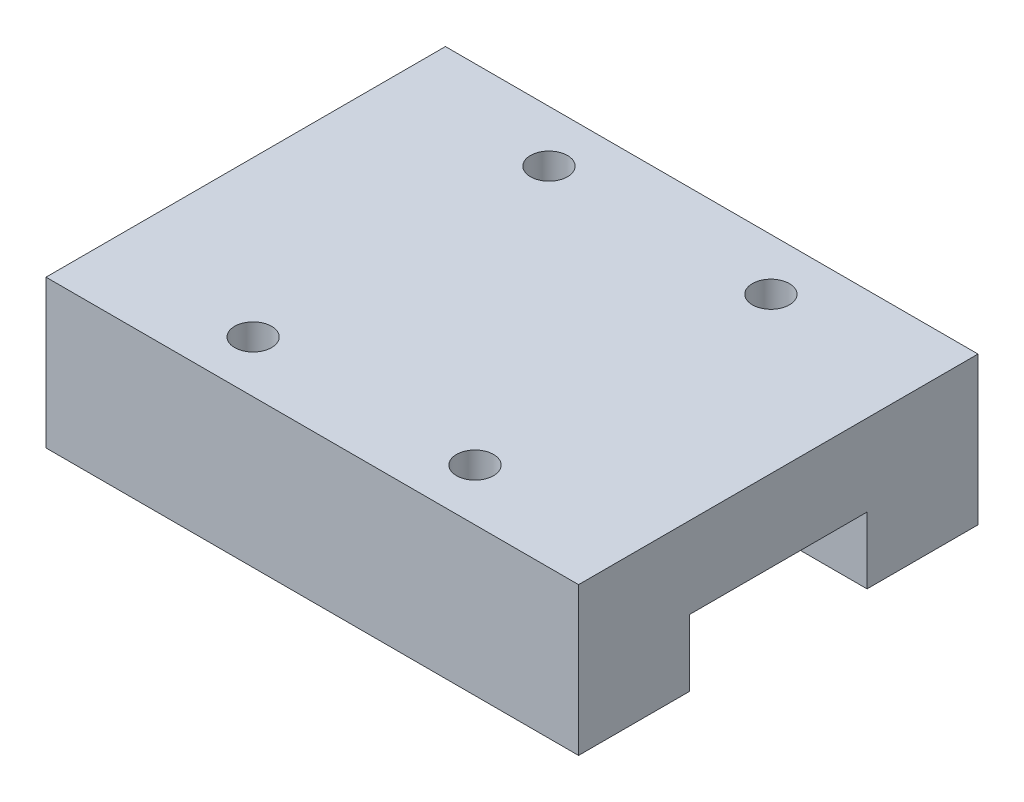
ISO-10303-21;
HEADER;
FILE_DESCRIPTION(('STEP AP214'),'2;1');
FILE_NAME('part.step','',(''),(''),'','','');
FILE_SCHEMA(('AUTOMOTIVE_DESIGN { 1 0 10303 214 1 1 1 1 }'));
ENDSEC;
DATA;
#1=APPLICATION_CONTEXT('core data for automotive mechanical design processes');
#2=APPLICATION_PROTOCOL_DEFINITION('international standard','automotive_design',2000,#1);
#3=PRODUCT_CONTEXT('',#1,'mechanical');
#4=PRODUCT('Part','Part','',(#3));
#5=PRODUCT_RELATED_PRODUCT_CATEGORY('part','',(#4));
#6=PRODUCT_DEFINITION_FORMATION('','',#4);
#7=PRODUCT_DEFINITION_CONTEXT('part definition',#1,'design');
#8=PRODUCT_DEFINITION('design','',#6,#7);
#9=PRODUCT_DEFINITION_SHAPE('','',#8);
#10=(LENGTH_UNIT() NAMED_UNIT(*) SI_UNIT(.MILLI.,.METRE.));
#11=(NAMED_UNIT(*) PLANE_ANGLE_UNIT() SI_UNIT($,.RADIAN.));
#12=(NAMED_UNIT(*) SI_UNIT($,.STERADIAN.) SOLID_ANGLE_UNIT());
#13=UNCERTAINTY_MEASURE_WITH_UNIT(LENGTH_MEASURE(1.E-05),#10,'distance_accuracy_value','');
#14=(GEOMETRIC_REPRESENTATION_CONTEXT(3) GLOBAL_UNCERTAINTY_ASSIGNED_CONTEXT((#13)) GLOBAL_UNIT_ASSIGNED_CONTEXT((#10,
#11,#12)) REPRESENTATION_CONTEXT('',''));
#15=CARTESIAN_POINT('',(0.,0.,0.));
#16=DIRECTION('',(0.,0.,1.));
#17=DIRECTION('',(1.,0.,0.));
#18=AXIS2_PLACEMENT_3D('',#15,#16,#17);
#19=CARTESIAN_POINT('',(36.,0.,13.5));
#20=DIRECTION('',(0.,0.,-1.));
#21=DIRECTION('',(0.,1.,0.));
#22=AXIS2_PLACEMENT_3D('',#19,#20,#21);
#23=PLANE('',#22);
#24=DIRECTION('',(0.,-1.,0.));
#25=VECTOR('',#24,1.);
#26=CARTESIAN_POINT('',(0.,0.,13.5));
#27=LINE('',#26,#25);
#28=CARTESIAN_POINT('',(0.,0.,13.5));
#29=VERTEX_POINT('',#28);
#30=CARTESIAN_POINT('',(0.,-10.,13.5));
#31=VERTEX_POINT('',#30);
#32=EDGE_CURVE('E133',#29,#31,#27,.T.);
#33=ORIENTED_EDGE('',*,*,#32,.T.);
#34=DIRECTION('',(-1.,0.,0.));
#35=VECTOR('',#34,1.);
#36=CARTESIAN_POINT('',(36.,-10.,13.5));
#37=LINE('',#36,#35);
#38=CARTESIAN_POINT('',(36.,-10.,13.5));
#39=VERTEX_POINT('',#38);
#40=EDGE_CURVE('E11',#39,#31,#37,.T.);
#41=ORIENTED_EDGE('',*,*,#40,.F.);
#42=DIRECTION('',(0.,-1.,0.));
#43=VECTOR('',#42,1.);
#44=CARTESIAN_POINT('',(36.,0.,13.5));
#45=LINE('',#44,#43);
#46=CARTESIAN_POINT('',(36.,0.,13.5));
#47=VERTEX_POINT('',#46);
#48=EDGE_CURVE('E148',#47,#39,#45,.T.);
#49=ORIENTED_EDGE('',*,*,#48,.F.);
#50=DIRECTION('',(-1.,0.,0.));
#51=VECTOR('',#50,1.);
#52=CARTESIAN_POINT('',(36.,0.,13.5));
#53=LINE('',#52,#51);
#54=EDGE_CURVE('E129',#47,#29,#53,.T.);
#55=ORIENTED_EDGE('',*,*,#54,.T.);
#56=EDGE_LOOP('',(#33,#41,#49,#55));
#57=FACE_BOUND('',#56,.T.);
#58=ADVANCED_FACE('F34',(#57),#23,.F.);
#59=CARTESIAN_POINT('',(36.,-10.,13.5));
#60=DIRECTION('',(0.,1.,0.));
#61=DIRECTION('',(0.,0.,1.));
#62=AXIS2_PLACEMENT_3D('',#59,#60,#61);
#63=PLANE('',#62);
#64=DIRECTION('',(0.,0.,-1.));
#65=VECTOR('',#64,1.);
#66=CARTESIAN_POINT('',(0.,-10.,13.5));
#67=LINE('',#66,#65);
#68=CARTESIAN_POINT('',(0.,-10.,6.));
#69=VERTEX_POINT('',#68);
#70=EDGE_CURVE('E136',#31,#69,#67,.T.);
#71=ORIENTED_EDGE('',*,*,#70,.T.);
#72=DIRECTION('',(-1.,0.,0.));
#73=VECTOR('',#72,1.);
#74=CARTESIAN_POINT('',(36.,-10.,6.));
#75=LINE('',#74,#73);
#76=CARTESIAN_POINT('',(36.,-10.,6.));
#77=VERTEX_POINT('',#76);
#78=EDGE_CURVE('E42',#77,#69,#75,.T.);
#79=ORIENTED_EDGE('',*,*,#78,.F.);
#80=DIRECTION('',(0.,0.,-1.));
#81=VECTOR('',#80,1.);
#82=CARTESIAN_POINT('',(36.,-10.,13.5));
#83=LINE('',#82,#81);
#84=EDGE_CURVE('E94',#39,#77,#83,.T.);
#85=ORIENTED_EDGE('',*,*,#84,.F.);
#86=ORIENTED_EDGE('',*,*,#40,.T.);
#87=EDGE_LOOP('',(#71,#79,#85,#86));
#88=FACE_BOUND('',#87,.T.);
#89=ADVANCED_FACE('F234',(#88),#63,.F.);
#90=CARTESIAN_POINT('',(36.,-5.5,6.));
#91=DIRECTION('',(0.,0.,1.));
#92=DIRECTION('',(0.,-1.,0.));
#93=AXIS2_PLACEMENT_3D('',#90,#91,#92);
#94=PLANE('',#93);
#95=DIRECTION('',(0.,1.,0.));
#96=VECTOR('',#95,1.);
#97=CARTESIAN_POINT('',(0.,-5.5,6.));
#98=LINE('',#97,#96);
#99=CARTESIAN_POINT('',(0.,-5.5,6.));
#100=VERTEX_POINT('',#99);
#101=EDGE_CURVE('E139',#69,#100,#98,.T.);
#102=ORIENTED_EDGE('',*,*,#101,.T.);
#103=DIRECTION('',(-1.,0.,0.));
#104=VECTOR('',#103,1.);
#105=CARTESIAN_POINT('',(36.,-5.5,6.));
#106=LINE('',#105,#104);
#107=CARTESIAN_POINT('',(36.,-5.5,6.));
#108=VERTEX_POINT('',#107);
#109=EDGE_CURVE('E155',#108,#100,#106,.T.);
#110=ORIENTED_EDGE('',*,*,#109,.F.);
#111=DIRECTION('',(0.,1.,0.));
#112=VECTOR('',#111,1.);
#113=CARTESIAN_POINT('',(36.,-5.5,6.));
#114=LINE('',#113,#112);
#115=EDGE_CURVE('E163',#77,#108,#114,.T.);
#116=ORIENTED_EDGE('',*,*,#115,.F.);
#117=ORIENTED_EDGE('',*,*,#78,.T.);
#118=EDGE_LOOP('',(#102,#110,#116,#117));
#119=FACE_BOUND('',#118,.T.);
#120=ADVANCED_FACE('F161',(#119),#94,.F.);
#121=CARTESIAN_POINT('',(36.,-5.5,6.));
#122=DIRECTION('',(0.,1.,0.));
#123=DIRECTION('',(0.,0.,1.));
#124=AXIS2_PLACEMENT_3D('',#121,#122,#123);
#125=PLANE('',#124);
#126=DIRECTION('',(0.,0.,-1.));
#127=VECTOR('',#126,1.);
#128=CARTESIAN_POINT('',(0.,-5.5,6.));
#129=LINE('',#128,#127);
#130=CARTESIAN_POINT('',(0.,-5.5,-6.));
#131=VERTEX_POINT('',#130);
#132=EDGE_CURVE('E141',#100,#131,#129,.T.);
#133=ORIENTED_EDGE('',*,*,#132,.T.);
#134=DIRECTION('',(-1.,0.,0.));
#135=VECTOR('',#134,1.);
#136=CARTESIAN_POINT('',(36.,-5.5,-6.));
#137=LINE('',#136,#135);
#138=CARTESIAN_POINT('',(36.,-5.5,-6.));
#139=VERTEX_POINT('',#138);
#140=EDGE_CURVE('E152',#139,#131,#137,.T.);
#141=ORIENTED_EDGE('',*,*,#140,.F.);
#142=DIRECTION('',(0.,0.,-1.));
#143=VECTOR('',#142,1.);
#144=CARTESIAN_POINT('',(36.,-5.5,6.));
#145=LINE('',#144,#143);
#146=EDGE_CURVE('E175',#108,#139,#145,.T.);
#147=ORIENTED_EDGE('',*,*,#146,.F.);
#148=ORIENTED_EDGE('',*,*,#109,.T.);
#149=EDGE_LOOP('',(#133,#141,#147,#148));
#150=FACE_BOUND('',#149,.T.);
#151=ADVANCED_FACE('F171',(#150),#125,.F.);
#152=CARTESIAN_POINT('',(36.,-5.5,-6.));
#153=DIRECTION('',(0.,0.,-1.));
#154=DIRECTION('',(0.,1.,0.));
#155=AXIS2_PLACEMENT_3D('',#152,#153,#154);
#156=PLANE('',#155);
#157=DIRECTION('',(0.,-1.,0.));
#158=VECTOR('',#157,1.);
#159=CARTESIAN_POINT('',(0.,-5.5,-6.));
#160=LINE('',#159,#158);
#161=CARTESIAN_POINT('',(0.,-10.,-6.));
#162=VERTEX_POINT('',#161);
#163=EDGE_CURVE('E143',#131,#162,#160,.T.);
#164=ORIENTED_EDGE('',*,*,#163,.T.);
#165=DIRECTION('',(-1.,0.,0.));
#166=VECTOR('',#165,1.);
#167=CARTESIAN_POINT('',(36.,-10.,-6.));
#168=LINE('',#167,#166);
#169=CARTESIAN_POINT('',(36.,-10.,-6.));
#170=VERTEX_POINT('',#169);
#171=EDGE_CURVE('E124',#170,#162,#168,.T.);
#172=ORIENTED_EDGE('',*,*,#171,.F.);
#173=DIRECTION('',(0.,-1.,0.));
#174=VECTOR('',#173,1.);
#175=CARTESIAN_POINT('',(36.,-5.5,-6.));
#176=LINE('',#175,#174);
#177=EDGE_CURVE('E115',#139,#170,#176,.T.);
#178=ORIENTED_EDGE('',*,*,#177,.F.);
#179=ORIENTED_EDGE('',*,*,#140,.T.);
#180=EDGE_LOOP('',(#164,#172,#178,#179));
#181=FACE_BOUND('',#180,.T.);
#182=ADVANCED_FACE('F174',(#181),#156,.F.);
#183=CARTESIAN_POINT('',(36.,-10.,-6.));
#184=DIRECTION('',(0.,1.,0.));
#185=DIRECTION('',(0.,0.,1.));
#186=AXIS2_PLACEMENT_3D('',#183,#184,#185);
#187=PLANE('',#186);
#188=DIRECTION('',(0.,0.,-1.));
#189=VECTOR('',#188,1.);
#190=CARTESIAN_POINT('',(0.,-10.,-6.));
#191=LINE('',#190,#189);
#192=CARTESIAN_POINT('',(0.,-10.,-13.5));
#193=VERTEX_POINT('',#192);
#194=EDGE_CURVE('E123',#162,#193,#191,.T.);
#195=ORIENTED_EDGE('',*,*,#194,.T.);
#196=DIRECTION('',(-1.,0.,0.));
#197=VECTOR('',#196,1.);
#198=CARTESIAN_POINT('',(36.,-10.,-13.5));
#199=LINE('',#198,#197);
#200=CARTESIAN_POINT('',(36.,-10.,-13.5));
#201=VERTEX_POINT('',#200);
#202=EDGE_CURVE('E120',#201,#193,#199,.T.);
#203=ORIENTED_EDGE('',*,*,#202,.F.);
#204=DIRECTION('',(0.,0.,-1.));
#205=VECTOR('',#204,1.);
#206=CARTESIAN_POINT('',(36.,-10.,-6.));
#207=LINE('',#206,#205);
#208=EDGE_CURVE('E109',#170,#201,#207,.T.);
#209=ORIENTED_EDGE('',*,*,#208,.F.);
#210=ORIENTED_EDGE('',*,*,#171,.T.);
#211=EDGE_LOOP('',(#195,#203,#209,#210));
#212=FACE_BOUND('',#211,.T.);
#213=ADVANCED_FACE('F121',(#212),#187,.F.);
#214=CARTESIAN_POINT('',(36.,0.,-13.5));
#215=DIRECTION('',(0.,0.,1.));
#216=DIRECTION('',(0.,-1.,0.));
#217=AXIS2_PLACEMENT_3D('',#214,#215,#216);
#218=PLANE('',#217);
#219=DIRECTION('',(0.,1.,0.));
#220=VECTOR('',#219,1.);
#221=CARTESIAN_POINT('',(0.,0.,-13.5));
#222=LINE('',#221,#220);
#223=CARTESIAN_POINT('',(0.,0.,-13.5));
#224=VERTEX_POINT('',#223);
#225=EDGE_CURVE('E80',#193,#224,#222,.T.);
#226=ORIENTED_EDGE('',*,*,#225,.T.);
#227=DIRECTION('',(-1.,0.,0.));
#228=VECTOR('',#227,1.);
#229=CARTESIAN_POINT('',(36.,0.,-13.5));
#230=LINE('',#229,#228);
#231=CARTESIAN_POINT('',(36.,0.,-13.5));
#232=VERTEX_POINT('',#231);
#233=EDGE_CURVE('E125',#232,#224,#230,.T.);
#234=ORIENTED_EDGE('',*,*,#233,.F.);
#235=DIRECTION('',(0.,1.,0.));
#236=VECTOR('',#235,1.);
#237=CARTESIAN_POINT('',(36.,0.,-13.5));
#238=LINE('',#237,#236);
#239=EDGE_CURVE('E113',#201,#232,#238,.T.);
#240=ORIENTED_EDGE('',*,*,#239,.F.);
#241=ORIENTED_EDGE('',*,*,#202,.T.);
#242=EDGE_LOOP('',(#226,#234,#240,#241));
#243=FACE_BOUND('',#242,.T.);
#244=ADVANCED_FACE('F127',(#243),#218,.F.);
#245=CARTESIAN_POINT('',(36.,0.,13.5));
#246=DIRECTION('',(0.,-1.,0.));
#247=DIRECTION('',(0.,0.,-1.));
#248=AXIS2_PLACEMENT_3D('',#245,#246,#247);
#249=PLANE('',#248);
#250=CARTESIAN_POINT('',(10.5,0.,10.));
#251=DIRECTION('',(0.,1.,0.));
#252=DIRECTION('',(0.,0.,1.));
#253=AXIS2_PLACEMENT_3D('',#250,#251,#252);
#254=CIRCLE('',#253,1.25);
#255=CARTESIAN_POINT('',(10.5,0.,11.25));
#256=VERTEX_POINT('',#255);
#257=EDGE_CURVE('E201',#256,#256,#254,.T.);
#258=ORIENTED_EDGE('',*,*,#257,.F.);
#259=EDGE_LOOP('',(#258));
#260=FACE_BOUND('',#259,.T.);
#261=CARTESIAN_POINT('',(25.5,0.,10.));
#262=DIRECTION('',(0.,1.,0.));
#263=DIRECTION('',(0.,0.,1.));
#264=AXIS2_PLACEMENT_3D('',#261,#262,#263);
#265=CIRCLE('',#264,1.25);
#266=CARTESIAN_POINT('',(25.5,0.,11.25));
#267=VERTEX_POINT('',#266);
#268=EDGE_CURVE('E195',#267,#267,#265,.T.);
#269=ORIENTED_EDGE('',*,*,#268,.F.);
#270=EDGE_LOOP('',(#269));
#271=FACE_BOUND('',#270,.T.);
#272=CARTESIAN_POINT('',(25.5,0.,-10.));
#273=DIRECTION('',(0.,1.,0.));
#274=DIRECTION('',(0.,0.,1.));
#275=AXIS2_PLACEMENT_3D('',#272,#273,#274);
#276=CIRCLE('',#275,1.25);
#277=CARTESIAN_POINT('',(25.5,0.,-8.75000000000001));
#278=VERTEX_POINT('',#277);
#279=EDGE_CURVE('E189',#278,#278,#276,.T.);
#280=ORIENTED_EDGE('',*,*,#279,.F.);
#281=EDGE_LOOP('',(#280));
#282=FACE_BOUND('',#281,.T.);
#283=CARTESIAN_POINT('',(10.5,0.,-10.));
#284=DIRECTION('',(0.,1.,0.));
#285=DIRECTION('',(0.,0.,1.));
#286=AXIS2_PLACEMENT_3D('',#283,#284,#285);
#287=CIRCLE('',#286,1.25);
#288=CARTESIAN_POINT('',(10.5,0.,-8.75));
#289=VERTEX_POINT('',#288);
#290=EDGE_CURVE('E183',#289,#289,#287,.T.);
#291=ORIENTED_EDGE('',*,*,#290,.F.);
#292=EDGE_LOOP('',(#291));
#293=FACE_BOUND('',#292,.T.);
#294=DIRECTION('',(0.,0.,1.));
#295=VECTOR('',#294,1.);
#296=CARTESIAN_POINT('',(0.,0.,13.5));
#297=LINE('',#296,#295);
#298=EDGE_CURVE('E86',#224,#29,#297,.T.);
#299=ORIENTED_EDGE('',*,*,#298,.T.);
#300=ORIENTED_EDGE('',*,*,#54,.F.);
#301=DIRECTION('',(0.,0.,1.));
#302=VECTOR('',#301,1.);
#303=CARTESIAN_POINT('',(36.,0.,13.5));
#304=LINE('',#303,#302);
#305=EDGE_CURVE('E50',#232,#47,#304,.T.);
#306=ORIENTED_EDGE('',*,*,#305,.F.);
#307=ORIENTED_EDGE('',*,*,#233,.T.);
#308=EDGE_LOOP('',(#299,#300,#306,#307));
#309=FACE_BOUND('',#308,.T.);
#310=ADVANCED_FACE('F207',(#260,#271,#282,#293,#309),#249,.F.);
#311=CARTESIAN_POINT('',(36.,-10.,13.5));
#312=DIRECTION('',(1.,0.,0.));
#313=DIRECTION('',(0.,0.,-1.));
#314=AXIS2_PLACEMENT_3D('',#311,#312,#313);
#315=PLANE('',#314);
#316=ORIENTED_EDGE('',*,*,#48,.T.);
#317=ORIENTED_EDGE('',*,*,#84,.T.);
#318=ORIENTED_EDGE('',*,*,#115,.T.);
#319=ORIENTED_EDGE('',*,*,#146,.T.);
#320=ORIENTED_EDGE('',*,*,#177,.T.);
#321=ORIENTED_EDGE('',*,*,#208,.T.);
#322=ORIENTED_EDGE('',*,*,#239,.T.);
#323=ORIENTED_EDGE('',*,*,#305,.T.);
#324=EDGE_LOOP('',(#316,#317,#318,#319,#320,#321,#322,#323));
#325=FACE_BOUND('',#324,.T.);
#326=ADVANCED_FACE('F111',(#325),#315,.T.);
#327=CARTESIAN_POINT('',(0.,-10.,13.5));
#328=DIRECTION('',(1.,0.,0.));
#329=DIRECTION('',(0.,0.,-1.));
#330=AXIS2_PLACEMENT_3D('',#327,#328,#329);
#331=PLANE('',#330);
#332=ORIENTED_EDGE('',*,*,#32,.F.);
#333=ORIENTED_EDGE('',*,*,#298,.F.);
#334=ORIENTED_EDGE('',*,*,#225,.F.);
#335=ORIENTED_EDGE('',*,*,#194,.F.);
#336=ORIENTED_EDGE('',*,*,#163,.F.);
#337=ORIENTED_EDGE('',*,*,#132,.F.);
#338=ORIENTED_EDGE('',*,*,#101,.F.);
#339=ORIENTED_EDGE('',*,*,#70,.F.);
#340=EDGE_LOOP('',(#332,#333,#334,#335,#336,#337,#338,#339));
#341=FACE_BOUND('',#340,.T.);
#342=ADVANCED_FACE('F167',(#341),#331,.F.);
#343=CARTESIAN_POINT('',(10.5,-8.5,-10.));
#344=DIRECTION('',(0.,1.,0.));
#345=DIRECTION('',(0.,0.,1.));
#346=AXIS2_PLACEMENT_3D('',#343,#344,#345);
#347=CONICAL_SURFACE('',#346,1.25,1.02974425867665);
#348=CARTESIAN_POINT('',(10.5,-9.25107577378445,-10.));
#349=VERTEX_POINT('',#348);
#350=VERTEX_LOOP('',#349);
#351=FACE_BOUND('',#350,.T.);
#352=CARTESIAN_POINT('',(10.5,-8.5,-10.));
#353=DIRECTION('',(0.,1.,0.));
#354=DIRECTION('',(0.,0.,1.));
#355=AXIS2_PLACEMENT_3D('',#352,#353,#354);
#356=CIRCLE('',#355,1.25);
#357=CARTESIAN_POINT('',(10.5,-8.5,-8.75));
#358=VERTEX_POINT('',#357);
#359=EDGE_CURVE('E137',#358,#358,#356,.T.);
#360=ORIENTED_EDGE('',*,*,#359,.T.);
#361=EDGE_LOOP('',(#360));
#362=FACE_BOUND('',#361,.T.);
#363=ADVANCED_FACE('F220',(#351,#362),#347,.F.);
#364=CARTESIAN_POINT('',(10.5,0.,-10.));
#365=DIRECTION('',(0.,1.,0.));
#366=DIRECTION('',(0.,0.,1.));
#367=AXIS2_PLACEMENT_3D('',#364,#365,#366);
#368=CYLINDRICAL_SURFACE('',#367,1.25);
#369=ORIENTED_EDGE('',*,*,#359,.F.);
#370=EDGE_LOOP('',(#369));
#371=FACE_BOUND('',#370,.T.);
#372=ORIENTED_EDGE('',*,*,#290,.T.);
#373=EDGE_LOOP('',(#372));
#374=FACE_BOUND('',#373,.T.);
#375=ADVANCED_FACE('F217',(#371,#374),#368,.F.);
#376=CARTESIAN_POINT('',(25.5,-8.5,-10.));
#377=DIRECTION('',(0.,1.,0.));
#378=DIRECTION('',(0.,0.,1.));
#379=AXIS2_PLACEMENT_3D('',#376,#377,#378);
#380=CONICAL_SURFACE('',#379,1.25,1.02974425867665);
#381=CARTESIAN_POINT('',(25.5,-9.25107577378445,-10.));
#382=VERTEX_POINT('',#381);
#383=VERTEX_LOOP('',#382);
#384=FACE_BOUND('',#383,.T.);
#385=CARTESIAN_POINT('',(25.5,-8.5,-10.));
#386=DIRECTION('',(0.,1.,0.));
#387=DIRECTION('',(0.,0.,1.));
#388=AXIS2_PLACEMENT_3D('',#385,#386,#387);
#389=CIRCLE('',#388,1.25);
#390=CARTESIAN_POINT('',(25.5,-8.5,-8.75000000000001));
#391=VERTEX_POINT('',#390);
#392=EDGE_CURVE('E186',#391,#391,#389,.T.);
#393=ORIENTED_EDGE('',*,*,#392,.T.);
#394=EDGE_LOOP('',(#393));
#395=FACE_BOUND('',#394,.T.);
#396=ADVANCED_FACE('F219',(#384,#395),#380,.F.);
#397=CARTESIAN_POINT('',(25.5,0.,-10.));
#398=DIRECTION('',(0.,1.,0.));
#399=DIRECTION('',(0.,0.,1.));
#400=AXIS2_PLACEMENT_3D('',#397,#398,#399);
#401=CYLINDRICAL_SURFACE('',#400,1.25);
#402=ORIENTED_EDGE('',*,*,#392,.F.);
#403=EDGE_LOOP('',(#402));
#404=FACE_BOUND('',#403,.T.);
#405=ORIENTED_EDGE('',*,*,#279,.T.);
#406=EDGE_LOOP('',(#405));
#407=FACE_BOUND('',#406,.T.);
#408=ADVANCED_FACE('F227',(#404,#407),#401,.F.);
#409=CARTESIAN_POINT('',(25.5,-8.5,10.));
#410=DIRECTION('',(0.,1.,0.));
#411=DIRECTION('',(0.,0.,1.));
#412=AXIS2_PLACEMENT_3D('',#409,#410,#411);
#413=CONICAL_SURFACE('',#412,1.25,1.02974425867665);
#414=CARTESIAN_POINT('',(25.5,-9.25107577378445,10.));
#415=VERTEX_POINT('',#414);
#416=VERTEX_LOOP('',#415);
#417=FACE_BOUND('',#416,.T.);
#418=CARTESIAN_POINT('',(25.5,-8.5,10.));
#419=DIRECTION('',(0.,1.,0.));
#420=DIRECTION('',(0.,0.,1.));
#421=AXIS2_PLACEMENT_3D('',#418,#419,#420);
#422=CIRCLE('',#421,1.25);
#423=CARTESIAN_POINT('',(25.5,-8.5,11.25));
#424=VERTEX_POINT('',#423);
#425=EDGE_CURVE('E192',#424,#424,#422,.T.);
#426=ORIENTED_EDGE('',*,*,#425,.T.);
#427=EDGE_LOOP('',(#426));
#428=FACE_BOUND('',#427,.T.);
#429=ADVANCED_FACE('F291',(#417,#428),#413,.F.);
#430=CARTESIAN_POINT('',(25.5,0.,10.));
#431=DIRECTION('',(0.,1.,0.));
#432=DIRECTION('',(0.,0.,1.));
#433=AXIS2_PLACEMENT_3D('',#430,#431,#432);
#434=CYLINDRICAL_SURFACE('',#433,1.25);
#435=ORIENTED_EDGE('',*,*,#425,.F.);
#436=EDGE_LOOP('',(#435));
#437=FACE_BOUND('',#436,.T.);
#438=ORIENTED_EDGE('',*,*,#268,.T.);
#439=EDGE_LOOP('',(#438));
#440=FACE_BOUND('',#439,.T.);
#441=ADVANCED_FACE('F301',(#437,#440),#434,.F.);
#442=CARTESIAN_POINT('',(10.5,-8.5,10.));
#443=DIRECTION('',(0.,1.,0.));
#444=DIRECTION('',(0.,0.,1.));
#445=AXIS2_PLACEMENT_3D('',#442,#443,#444);
#446=CONICAL_SURFACE('',#445,1.25,1.02974425867665);
#447=CARTESIAN_POINT('',(10.5,-9.25107577378445,10.));
#448=VERTEX_POINT('',#447);
#449=VERTEX_LOOP('',#448);
#450=FACE_BOUND('',#449,.T.);
#451=CARTESIAN_POINT('',(10.5,-8.5,10.));
#452=DIRECTION('',(0.,1.,0.));
#453=DIRECTION('',(0.,0.,1.));
#454=AXIS2_PLACEMENT_3D('',#451,#452,#453);
#455=CIRCLE('',#454,1.25);
#456=CARTESIAN_POINT('',(10.5,-8.5,11.25));
#457=VERTEX_POINT('',#456);
#458=EDGE_CURVE('E198',#457,#457,#455,.T.);
#459=ORIENTED_EDGE('',*,*,#458,.T.);
#460=EDGE_LOOP('',(#459));
#461=FACE_BOUND('',#460,.T.);
#462=ADVANCED_FACE('F311',(#450,#461),#446,.F.);
#463=CARTESIAN_POINT('',(10.5,0.,10.));
#464=DIRECTION('',(0.,1.,0.));
#465=DIRECTION('',(0.,0.,1.));
#466=AXIS2_PLACEMENT_3D('',#463,#464,#465);
#467=CYLINDRICAL_SURFACE('',#466,1.25);
#468=ORIENTED_EDGE('',*,*,#458,.F.);
#469=EDGE_LOOP('',(#468));
#470=FACE_BOUND('',#469,.T.);
#471=ORIENTED_EDGE('',*,*,#257,.T.);
#472=EDGE_LOOP('',(#471));
#473=FACE_BOUND('',#472,.T.);
#474=ADVANCED_FACE('F205',(#470,#473),#467,.F.);
#475=CLOSED_SHELL('',(#58,#89,#120,#151,#182,#213,#244,#310,#326,#342,#363,#375,#396,#408,#429,
#441,#462,#474));
#476=MANIFOLD_SOLID_BREP('B2',#475);
#477=ADVANCED_BREP_SHAPE_REPRESENTATION('',(#18,#476),#14);
#478=SHAPE_DEFINITION_REPRESENTATION(#9,#477);
ENDSEC;
END-ISO-10303-21;
